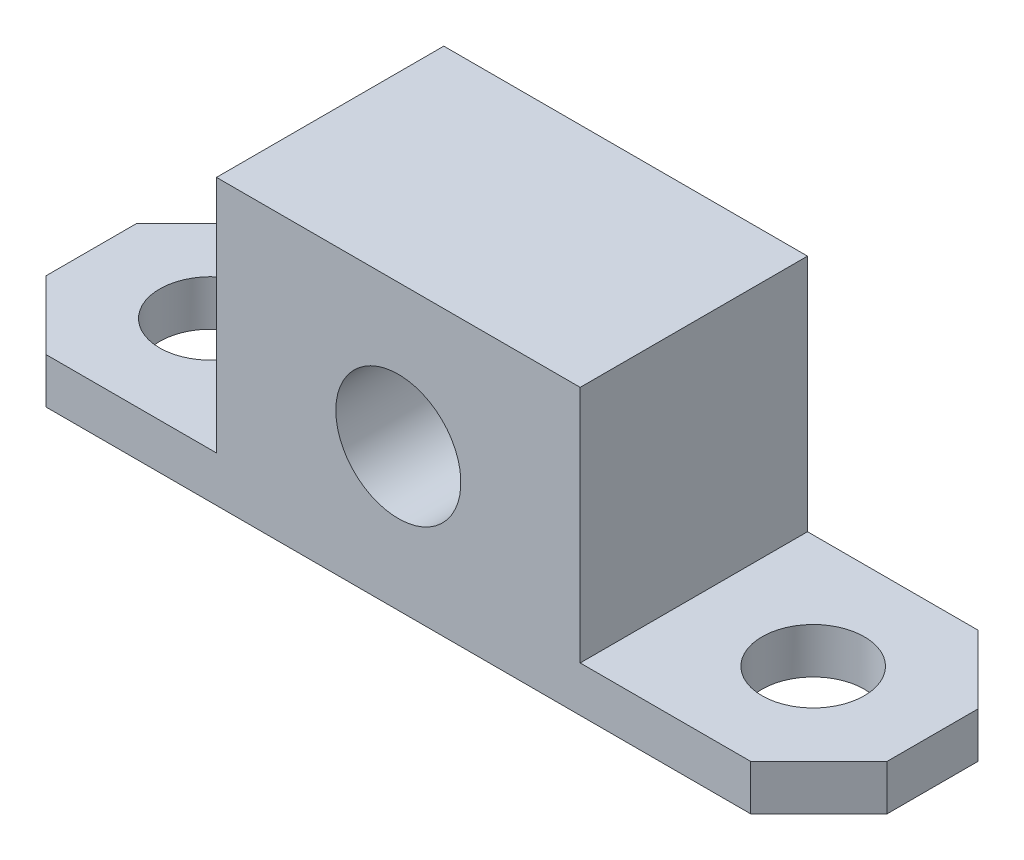
ISO-10303-21;
HEADER;
FILE_DESCRIPTION(('STEP AP214'),'2;1');
FILE_NAME('part.step','',(''),(''),'','','');
FILE_SCHEMA(('AUTOMOTIVE_DESIGN { 1 0 10303 214 1 1 1 1 }'));
ENDSEC;
DATA;
#1=APPLICATION_CONTEXT('core data for automotive mechanical design processes');
#2=APPLICATION_PROTOCOL_DEFINITION('international standard','automotive_design',2000,#1);
#3=PRODUCT_CONTEXT('',#1,'mechanical');
#4=PRODUCT('Part','Part','',(#3));
#5=PRODUCT_RELATED_PRODUCT_CATEGORY('part','',(#4));
#6=PRODUCT_DEFINITION_FORMATION('','',#4);
#7=PRODUCT_DEFINITION_CONTEXT('part definition',#1,'design');
#8=PRODUCT_DEFINITION('design','',#6,#7);
#9=PRODUCT_DEFINITION_SHAPE('','',#8);
#10=(LENGTH_UNIT() NAMED_UNIT(*) SI_UNIT(.MILLI.,.METRE.));
#11=(NAMED_UNIT(*) PLANE_ANGLE_UNIT() SI_UNIT($,.RADIAN.));
#12=(NAMED_UNIT(*) SI_UNIT($,.STERADIAN.) SOLID_ANGLE_UNIT());
#13=UNCERTAINTY_MEASURE_WITH_UNIT(LENGTH_MEASURE(1.E-05),#10,'distance_accuracy_value','');
#14=(GEOMETRIC_REPRESENTATION_CONTEXT(3) GLOBAL_UNCERTAINTY_ASSIGNED_CONTEXT((#13)) GLOBAL_UNIT_ASSIGNED_CONTEXT((#10,
#11,#12)) REPRESENTATION_CONTEXT('',''));
#15=CARTESIAN_POINT('',(0.,0.,0.));
#16=DIRECTION('',(0.,0.,1.));
#17=DIRECTION('',(1.,0.,0.));
#18=AXIS2_PLACEMENT_3D('',#15,#16,#17);
#19=CARTESIAN_POINT('',(0.,2.,0.));
#20=DIRECTION('',(0.,-1.,0.));
#21=DIRECTION('',(0.,0.,-1.));
#22=AXIS2_PLACEMENT_3D('',#19,#20,#21);
#23=PLANE('',#22);
#24=CARTESIAN_POINT('',(31.75,2.,-5.));
#25=DIRECTION('',(0.,1.,0.));
#26=DIRECTION('',(0.,0.,1.));
#27=AXIS2_PLACEMENT_3D('',#24,#25,#26);
#28=CIRCLE('',#27,2.25);
#29=CARTESIAN_POINT('',(31.75,2.,-2.75));
#30=VERTEX_POINT('',#29);
#31=EDGE_CURVE('E184',#30,#30,#28,.T.);
#32=ORIENTED_EDGE('',*,*,#31,.F.);
#33=EDGE_LOOP('',(#32));
#34=FACE_BOUND('',#33,.T.);
#35=DIRECTION('',(1.,0.,0.));
#36=VECTOR('',#35,1.);
#37=CARTESIAN_POINT('',(0.,2.,0.));
#38=LINE('',#37,#36);
#39=CARTESIAN_POINT('',(26.5,2.,0.));
#40=VERTEX_POINT('',#39);
#41=CARTESIAN_POINT('',(34.,2.,0.));
#42=VERTEX_POINT('',#41);
#43=EDGE_CURVE('E161',#40,#42,#38,.T.);
#44=ORIENTED_EDGE('',*,*,#43,.T.);
#45=DIRECTION('',(-0.707106781186548,0.,0.707106781186547));
#46=VECTOR('',#45,1.);
#47=CARTESIAN_POINT('',(37.,2.,-3.));
#48=LINE('',#47,#46);
#49=CARTESIAN_POINT('',(37.,2.,-3.));
#50=VERTEX_POINT('',#49);
#51=EDGE_CURVE('E11',#42,#50,#48,.F.);
#52=ORIENTED_EDGE('',*,*,#51,.T.);
#53=DIRECTION('',(0.,0.,-1.));
#54=VECTOR('',#53,1.);
#55=CARTESIAN_POINT('',(37.,2.,0.));
#56=LINE('',#55,#54);
#57=CARTESIAN_POINT('',(37.,2.,-6.99999999999998));
#58=VERTEX_POINT('',#57);
#59=EDGE_CURVE('E165',#50,#58,#56,.T.);
#60=ORIENTED_EDGE('',*,*,#59,.T.);
#61=DIRECTION('',(0.707106781186546,0.,0.707106781186549));
#62=VECTOR('',#61,1.);
#63=CARTESIAN_POINT('',(34.,2.,-10.));
#64=LINE('',#63,#62);
#65=CARTESIAN_POINT('',(34.,2.,-10.));
#66=VERTEX_POINT('',#65);
#67=EDGE_CURVE('E41',#58,#66,#64,.F.);
#68=ORIENTED_EDGE('',*,*,#67,.T.);
#69=DIRECTION('',(-1.,0.,0.));
#70=VECTOR('',#69,1.);
#71=CARTESIAN_POINT('',(0.,2.,-10.));
#72=LINE('',#71,#70);
#73=CARTESIAN_POINT('',(26.5,2.,-10.));
#74=VERTEX_POINT('',#73);
#75=EDGE_CURVE('E168',#66,#74,#72,.T.);
#76=ORIENTED_EDGE('',*,*,#75,.T.);
#77=DIRECTION('',(0.,0.,-1.));
#78=VECTOR('',#77,1.);
#79=CARTESIAN_POINT('',(26.5,2.,0.));
#80=LINE('',#79,#78);
#81=EDGE_CURVE('E148',#40,#74,#80,.T.);
#82=ORIENTED_EDGE('',*,*,#81,.F.);
#83=EDGE_LOOP('',(#44,#52,#60,#68,#76,#82));
#84=FACE_BOUND('',#83,.T.);
#85=ADVANCED_FACE('F33',(#34,#84),#23,.F.);
#86=CARTESIAN_POINT('',(5.25,2.,-5.));
#87=DIRECTION('',(0.,1.,0.));
#88=DIRECTION('',(0.,0.,1.));
#89=AXIS2_PLACEMENT_3D('',#86,#87,#88);
#90=CIRCLE('',#89,2.25);
#91=CARTESIAN_POINT('',(5.25,2.,-2.75));
#92=VERTEX_POINT('',#91);
#93=EDGE_CURVE('E180',#92,#92,#90,.T.);
#94=ORIENTED_EDGE('',*,*,#93,.F.);
#95=EDGE_LOOP('',(#94));
#96=FACE_BOUND('',#95,.T.);
#97=CARTESIAN_POINT('',(10.5,2.,-10.));
#98=VERTEX_POINT('',#97);
#99=CARTESIAN_POINT('',(3.00000000000001,2.,-10.));
#100=VERTEX_POINT('',#99);
#101=EDGE_CURVE('E167',#98,#100,#72,.T.);
#102=ORIENTED_EDGE('',*,*,#101,.T.);
#103=DIRECTION('',(0.707106781186548,0.,-0.707106781186547));
#104=VECTOR('',#103,1.);
#105=CARTESIAN_POINT('',(0.,2.,-7.));
#106=LINE('',#105,#104);
#107=CARTESIAN_POINT('',(0.,2.,-7.));
#108=VERTEX_POINT('',#107);
#109=EDGE_CURVE('E204',#100,#108,#106,.F.);
#110=ORIENTED_EDGE('',*,*,#109,.T.);
#111=DIRECTION('',(0.,0.,1.));
#112=VECTOR('',#111,1.);
#113=CARTESIAN_POINT('',(0.,2.,0.));
#114=LINE('',#113,#112);
#115=CARTESIAN_POINT('',(0.,2.,-3.00000000000001));
#116=VERTEX_POINT('',#115);
#117=EDGE_CURVE('E158',#108,#116,#114,.T.);
#118=ORIENTED_EDGE('',*,*,#117,.T.);
#119=DIRECTION('',(-0.707106781186547,0.,-0.707106781186548));
#120=VECTOR('',#119,1.);
#121=CARTESIAN_POINT('',(3.,2.,0.));
#122=LINE('',#121,#120);
#123=CARTESIAN_POINT('',(3.,2.,0.));
#124=VERTEX_POINT('',#123);
#125=EDGE_CURVE('E202',#116,#124,#122,.F.);
#126=ORIENTED_EDGE('',*,*,#125,.T.);
#127=CARTESIAN_POINT('',(10.5,2.,0.));
#128=VERTEX_POINT('',#127);
#129=EDGE_CURVE('E163',#124,#128,#38,.T.);
#130=ORIENTED_EDGE('',*,*,#129,.T.);
#131=DIRECTION('',(0.,0.,1.));
#132=VECTOR('',#131,1.);
#133=CARTESIAN_POINT('',(10.5,2.,0.));
#134=LINE('',#133,#132);
#135=EDGE_CURVE('E145',#98,#128,#134,.T.);
#136=ORIENTED_EDGE('',*,*,#135,.F.);
#137=EDGE_LOOP('',(#102,#110,#118,#126,#130,#136));
#138=FACE_BOUND('',#137,.T.);
#139=ADVANCED_FACE('F248',(#96,#138),#23,.F.);
#140=CARTESIAN_POINT('',(0.,2.,0.));
#141=DIRECTION('',(1.,0.,0.));
#142=DIRECTION('',(0.,0.,-1.));
#143=AXIS2_PLACEMENT_3D('',#140,#141,#142);
#144=PLANE('',#143);
#145=ORIENTED_EDGE('',*,*,#117,.F.);
#146=DIRECTION('',(0.,-1.,0.));
#147=VECTOR('',#146,1.);
#148=CARTESIAN_POINT('',(0.,2.,-7.));
#149=LINE('',#148,#147);
#150=CARTESIAN_POINT('',(0.,0.,-7.));
#151=VERTEX_POINT('',#150);
#152=EDGE_CURVE('E186',#108,#151,#149,.T.);
#153=ORIENTED_EDGE('',*,*,#152,.T.);
#154=DIRECTION('',(0.,0.,1.));
#155=VECTOR('',#154,1.);
#156=CARTESIAN_POINT('',(0.,0.,0.));
#157=LINE('',#156,#155);
#158=CARTESIAN_POINT('',(0.,0.,-3.00000000000001));
#159=VERTEX_POINT('',#158);
#160=EDGE_CURVE('E149',#151,#159,#157,.T.);
#161=ORIENTED_EDGE('',*,*,#160,.T.);
#162=DIRECTION('',(0.,1.,0.));
#163=VECTOR('',#162,1.);
#164=CARTESIAN_POINT('',(0.,2.,-3.00000000000001));
#165=LINE('',#164,#163);
#166=EDGE_CURVE('E169',#159,#116,#165,.T.);
#167=ORIENTED_EDGE('',*,*,#166,.T.);
#168=EDGE_LOOP('',(#145,#153,#161,#167));
#169=FACE_BOUND('',#168,.T.);
#170=ADVANCED_FACE('F240',(#169),#144,.F.);
#171=CARTESIAN_POINT('',(0.,2.,0.));
#172=DIRECTION('',(0.,0.,-1.));
#173=DIRECTION('',(-1.,0.,0.));
#174=AXIS2_PLACEMENT_3D('',#171,#172,#173);
#175=PLANE('',#174);
#176=CARTESIAN_POINT('',(18.5,6.25,0.));
#177=DIRECTION('',(0.,0.,-1.));
#178=DIRECTION('',(-1.,0.,0.));
#179=AXIS2_PLACEMENT_3D('',#176,#177,#178);
#180=CIRCLE('',#179,2.75);
#181=CARTESIAN_POINT('',(15.75,6.25,0.));
#182=VERTEX_POINT('',#181);
#183=EDGE_CURVE('E253',#182,#182,#180,.T.);
#184=ORIENTED_EDGE('',*,*,#183,.T.);
#185=EDGE_LOOP('',(#184));
#186=FACE_BOUND('',#185,.T.);
#187=ORIENTED_EDGE('',*,*,#129,.F.);
#188=DIRECTION('',(0.,-1.,0.));
#189=VECTOR('',#188,1.);
#190=CARTESIAN_POINT('',(3.,2.,0.));
#191=LINE('',#190,#189);
#192=CARTESIAN_POINT('',(3.,0.,0.));
#193=VERTEX_POINT('',#192);
#194=EDGE_CURVE('E208',#124,#193,#191,.T.);
#195=ORIENTED_EDGE('',*,*,#194,.T.);
#196=DIRECTION('',(1.,0.,0.));
#197=VECTOR('',#196,1.);
#198=CARTESIAN_POINT('',(0.,0.,0.));
#199=LINE('',#198,#197);
#200=CARTESIAN_POINT('',(34.,0.,0.));
#201=VERTEX_POINT('',#200);
#202=EDGE_CURVE('E152',#193,#201,#199,.T.);
#203=ORIENTED_EDGE('',*,*,#202,.T.);
#204=DIRECTION('',(0.,1.,0.));
#205=VECTOR('',#204,1.);
#206=CARTESIAN_POINT('',(34.,2.,0.));
#207=LINE('',#206,#205);
#208=EDGE_CURVE('E206',#201,#42,#207,.T.);
#209=ORIENTED_EDGE('',*,*,#208,.T.);
#210=ORIENTED_EDGE('',*,*,#43,.F.);
#211=DIRECTION('',(0.,-1.,0.));
#212=VECTOR('',#211,1.);
#213=CARTESIAN_POINT('',(26.5,12.5,0.));
#214=LINE('',#213,#212);
#215=CARTESIAN_POINT('',(26.5,12.5,0.));
#216=VERTEX_POINT('',#215);
#217=EDGE_CURVE('E257',#216,#40,#214,.T.);
#218=ORIENTED_EDGE('',*,*,#217,.F.);
#219=DIRECTION('',(1.,0.,0.));
#220=VECTOR('',#219,1.);
#221=CARTESIAN_POINT('',(10.5,12.5,0.));
#222=LINE('',#221,#220);
#223=CARTESIAN_POINT('',(10.5,12.5,0.));
#224=VERTEX_POINT('',#223);
#225=EDGE_CURVE('E141',#224,#216,#222,.T.);
#226=ORIENTED_EDGE('',*,*,#225,.F.);
#227=DIRECTION('',(0.,-1.,0.));
#228=VECTOR('',#227,1.);
#229=CARTESIAN_POINT('',(10.5,12.5,0.));
#230=LINE('',#229,#228);
#231=EDGE_CURVE('E154',#224,#128,#230,.T.);
#232=ORIENTED_EDGE('',*,*,#231,.T.);
#233=EDGE_LOOP('',(#187,#195,#203,#209,#210,#218,#226,#232));
#234=FACE_BOUND('',#233,.T.);
#235=ADVANCED_FACE('F230',(#186,#234),#175,.F.);
#236=CARTESIAN_POINT('',(37.,2.,0.));
#237=DIRECTION('',(-1.,0.,0.));
#238=DIRECTION('',(0.,0.,1.));
#239=AXIS2_PLACEMENT_3D('',#236,#237,#238);
#240=PLANE('',#239);
#241=ORIENTED_EDGE('',*,*,#59,.F.);
#242=DIRECTION('',(0.,-1.,0.));
#243=VECTOR('',#242,1.);
#244=CARTESIAN_POINT('',(37.,2.,-3.));
#245=LINE('',#244,#243);
#246=CARTESIAN_POINT('',(37.,0.,-3.));
#247=VERTEX_POINT('',#246);
#248=EDGE_CURVE('E212',#50,#247,#245,.T.);
#249=ORIENTED_EDGE('',*,*,#248,.T.);
#250=DIRECTION('',(0.,0.,-1.));
#251=VECTOR('',#250,1.);
#252=CARTESIAN_POINT('',(37.,0.,0.));
#253=LINE('',#252,#251);
#254=CARTESIAN_POINT('',(37.,0.,-6.99999999999998));
#255=VERTEX_POINT('',#254);
#256=EDGE_CURVE('E173',#247,#255,#253,.T.);
#257=ORIENTED_EDGE('',*,*,#256,.T.);
#258=DIRECTION('',(0.,1.,0.));
#259=VECTOR('',#258,1.);
#260=CARTESIAN_POINT('',(37.,2.,-6.99999999999998));
#261=LINE('',#260,#259);
#262=EDGE_CURVE('E48',#255,#58,#261,.T.);
#263=ORIENTED_EDGE('',*,*,#262,.T.);
#264=EDGE_LOOP('',(#241,#249,#257,#263));
#265=FACE_BOUND('',#264,.T.);
#266=ADVANCED_FACE('F222',(#265),#240,.F.);
#267=CARTESIAN_POINT('',(0.,2.,-10.));
#268=DIRECTION('',(0.,0.,1.));
#269=DIRECTION('',(1.,0.,0.));
#270=AXIS2_PLACEMENT_3D('',#267,#268,#269);
#271=PLANE('',#270);
#272=CARTESIAN_POINT('',(18.5,6.25,-10.));
#273=DIRECTION('',(0.,0.,-1.));
#274=DIRECTION('',(-1.,0.,0.));
#275=AXIS2_PLACEMENT_3D('',#272,#273,#274);
#276=CIRCLE('',#275,2.75);
#277=CARTESIAN_POINT('',(15.75,6.25,-10.));
#278=VERTEX_POINT('',#277);
#279=EDGE_CURVE('E179',#278,#278,#276,.T.);
#280=ORIENTED_EDGE('',*,*,#279,.F.);
#281=EDGE_LOOP('',(#280));
#282=FACE_BOUND('',#281,.T.);
#283=DIRECTION('',(-1.,0.,0.));
#284=VECTOR('',#283,1.);
#285=CARTESIAN_POINT('',(0.,0.,-10.));
#286=LINE('',#285,#284);
#287=CARTESIAN_POINT('',(34.,0.,-10.));
#288=VERTEX_POINT('',#287);
#289=CARTESIAN_POINT('',(3.00000000000001,0.,-10.));
#290=VERTEX_POINT('',#289);
#291=EDGE_CURVE('E162',#288,#290,#286,.T.);
#292=ORIENTED_EDGE('',*,*,#291,.T.);
#293=DIRECTION('',(0.,1.,0.));
#294=VECTOR('',#293,1.);
#295=CARTESIAN_POINT('',(3.00000000000001,2.,-10.));
#296=LINE('',#295,#294);
#297=EDGE_CURVE('E200',#290,#100,#296,.T.);
#298=ORIENTED_EDGE('',*,*,#297,.T.);
#299=ORIENTED_EDGE('',*,*,#101,.F.);
#300=DIRECTION('',(0.,-1.,0.));
#301=VECTOR('',#300,1.);
#302=CARTESIAN_POINT('',(10.5,12.5,-10.));
#303=LINE('',#302,#301);
#304=CARTESIAN_POINT('',(10.5,12.5,-10.));
#305=VERTEX_POINT('',#304);
#306=EDGE_CURVE('E132',#305,#98,#303,.T.);
#307=ORIENTED_EDGE('',*,*,#306,.F.);
#308=DIRECTION('',(-1.,0.,0.));
#309=VECTOR('',#308,1.);
#310=CARTESIAN_POINT('',(10.5,12.5,-10.));
#311=LINE('',#310,#309);
#312=CARTESIAN_POINT('',(26.5,12.5,-10.));
#313=VERTEX_POINT('',#312);
#314=EDGE_CURVE('E122',#313,#305,#311,.T.);
#315=ORIENTED_EDGE('',*,*,#314,.F.);
#316=DIRECTION('',(0.,-1.,0.));
#317=VECTOR('',#316,1.);
#318=CARTESIAN_POINT('',(26.5,12.5,-10.));
#319=LINE('',#318,#317);
#320=EDGE_CURVE('E128',#313,#74,#319,.T.);
#321=ORIENTED_EDGE('',*,*,#320,.T.);
#322=ORIENTED_EDGE('',*,*,#75,.F.);
#323=DIRECTION('',(0.,-1.,0.));
#324=VECTOR('',#323,1.);
#325=CARTESIAN_POINT('',(34.,2.,-10.));
#326=LINE('',#325,#324);
#327=EDGE_CURVE('E197',#66,#288,#326,.T.);
#328=ORIENTED_EDGE('',*,*,#327,.T.);
#329=EDGE_LOOP('',(#292,#298,#299,#307,#315,#321,#322,#328));
#330=FACE_BOUND('',#329,.T.);
#331=ADVANCED_FACE('F125',(#282,#330),#271,.F.);
#332=CARTESIAN_POINT('',(0.,0.,0.));
#333=DIRECTION('',(0.,-1.,0.));
#334=DIRECTION('',(0.,0.,-1.));
#335=AXIS2_PLACEMENT_3D('',#332,#333,#334);
#336=PLANE('',#335);
#337=CARTESIAN_POINT('',(31.75,0.,-5.));
#338=DIRECTION('',(0.,-1.,0.));
#339=DIRECTION('',(0.,0.,-1.));
#340=AXIS2_PLACEMENT_3D('',#337,#338,#339);
#341=CIRCLE('',#340,2.25);
#342=CARTESIAN_POINT('',(31.75,0.,-7.25));
#343=VERTEX_POINT('',#342);
#344=EDGE_CURVE('E181',#343,#343,#341,.T.);
#345=ORIENTED_EDGE('',*,*,#344,.F.);
#346=EDGE_LOOP('',(#345));
#347=FACE_BOUND('',#346,.T.);
#348=CARTESIAN_POINT('',(5.25,0.,-5.));
#349=DIRECTION('',(0.,-1.,0.));
#350=DIRECTION('',(0.,0.,-1.));
#351=AXIS2_PLACEMENT_3D('',#348,#349,#350);
#352=CIRCLE('',#351,2.25);
#353=CARTESIAN_POINT('',(5.25,0.,-7.25));
#354=VERTEX_POINT('',#353);
#355=EDGE_CURVE('E176',#354,#354,#352,.T.);
#356=ORIENTED_EDGE('',*,*,#355,.F.);
#357=EDGE_LOOP('',(#356));
#358=FACE_BOUND('',#357,.T.);
#359=ORIENTED_EDGE('',*,*,#160,.F.);
#360=DIRECTION('',(-0.707106781186548,0.,0.707106781186547));
#361=VECTOR('',#360,1.);
#362=CARTESIAN_POINT('',(-3.5,0.,-3.5));
#363=LINE('',#362,#361);
#364=EDGE_CURVE('E195',#151,#290,#363,.F.);
#365=ORIENTED_EDGE('',*,*,#364,.T.);
#366=ORIENTED_EDGE('',*,*,#291,.F.);
#367=DIRECTION('',(-0.707106781186546,0.,-0.707106781186549));
#368=VECTOR('',#367,1.);
#369=CARTESIAN_POINT('',(22.0000000000001,0.,-22.));
#370=LINE('',#369,#368);
#371=EDGE_CURVE('E189',#288,#255,#370,.F.);
#372=ORIENTED_EDGE('',*,*,#371,.T.);
#373=ORIENTED_EDGE('',*,*,#256,.F.);
#374=DIRECTION('',(0.707106781186548,0.,-0.707106781186547));
#375=VECTOR('',#374,1.);
#376=CARTESIAN_POINT('',(17.,0.,17.));
#377=LINE('',#376,#375);
#378=EDGE_CURVE('E191',#247,#201,#377,.F.);
#379=ORIENTED_EDGE('',*,*,#378,.T.);
#380=ORIENTED_EDGE('',*,*,#202,.F.);
#381=DIRECTION('',(0.707106781186547,0.,0.707106781186548));
#382=VECTOR('',#381,1.);
#383=CARTESIAN_POINT('',(1.5,0.,-1.5));
#384=LINE('',#383,#382);
#385=EDGE_CURVE('E193',#193,#159,#384,.F.);
#386=ORIENTED_EDGE('',*,*,#385,.T.);
#387=EDGE_LOOP('',(#359,#365,#366,#372,#373,#379,#380,#386));
#388=FACE_BOUND('',#387,.T.);
#389=ADVANCED_FACE('F221',(#347,#358,#388),#336,.T.);
#390=CARTESIAN_POINT('',(26.5,12.5,0.));
#391=DIRECTION('',(-1.,0.,0.));
#392=DIRECTION('',(0.,0.,1.));
#393=AXIS2_PLACEMENT_3D('',#390,#391,#392);
#394=PLANE('',#393);
#395=ORIENTED_EDGE('',*,*,#81,.T.);
#396=ORIENTED_EDGE('',*,*,#320,.F.);
#397=DIRECTION('',(0.,0.,-1.));
#398=VECTOR('',#397,1.);
#399=CARTESIAN_POINT('',(26.5,12.5,0.));
#400=LINE('',#399,#398);
#401=EDGE_CURVE('E136',#216,#313,#400,.T.);
#402=ORIENTED_EDGE('',*,*,#401,.F.);
#403=ORIENTED_EDGE('',*,*,#217,.T.);
#404=EDGE_LOOP('',(#395,#396,#402,#403));
#405=FACE_BOUND('',#404,.T.);
#406=ADVANCED_FACE('F147',(#405),#394,.F.);
#407=CARTESIAN_POINT('',(10.5,12.5,0.));
#408=DIRECTION('',(1.,0.,0.));
#409=DIRECTION('',(0.,0.,-1.));
#410=AXIS2_PLACEMENT_3D('',#407,#408,#409);
#411=PLANE('',#410);
#412=ORIENTED_EDGE('',*,*,#135,.T.);
#413=ORIENTED_EDGE('',*,*,#231,.F.);
#414=DIRECTION('',(0.,0.,1.));
#415=VECTOR('',#414,1.);
#416=CARTESIAN_POINT('',(10.5,12.5,0.));
#417=LINE('',#416,#415);
#418=EDGE_CURVE('E135',#305,#224,#417,.T.);
#419=ORIENTED_EDGE('',*,*,#418,.F.);
#420=ORIENTED_EDGE('',*,*,#306,.T.);
#421=EDGE_LOOP('',(#412,#413,#419,#420));
#422=FACE_BOUND('',#421,.T.);
#423=ADVANCED_FACE('F258',(#422),#411,.F.);
#424=CARTESIAN_POINT('',(0.,12.5,0.));
#425=DIRECTION('',(0.,-1.,0.));
#426=DIRECTION('',(0.,0.,-1.));
#427=AXIS2_PLACEMENT_3D('',#424,#425,#426);
#428=PLANE('',#427);
#429=ORIENTED_EDGE('',*,*,#401,.T.);
#430=ORIENTED_EDGE('',*,*,#314,.T.);
#431=ORIENTED_EDGE('',*,*,#418,.T.);
#432=ORIENTED_EDGE('',*,*,#225,.T.);
#433=EDGE_LOOP('',(#429,#430,#431,#432));
#434=FACE_BOUND('',#433,.T.);
#435=ADVANCED_FACE('F139',(#434),#428,.F.);
#436=CARTESIAN_POINT('',(18.5,6.25,0.));
#437=DIRECTION('',(0.,0.,-1.));
#438=DIRECTION('',(-1.,0.,0.));
#439=AXIS2_PLACEMENT_3D('',#436,#437,#438);
#440=CYLINDRICAL_SURFACE('',#439,2.75);
#441=ORIENTED_EDGE('',*,*,#183,.F.);
#442=EDGE_LOOP('',(#441));
#443=FACE_BOUND('',#442,.T.);
#444=ORIENTED_EDGE('',*,*,#279,.T.);
#445=EDGE_LOOP('',(#444));
#446=FACE_BOUND('',#445,.T.);
#447=ADVANCED_FACE('F386',(#443,#446),#440,.F.);
#448=CARTESIAN_POINT('',(5.25,-8.,-5.));
#449=DIRECTION('',(0.,1.,0.));
#450=DIRECTION('',(0.,0.,1.));
#451=AXIS2_PLACEMENT_3D('',#448,#449,#450);
#452=CYLINDRICAL_SURFACE('',#451,2.25);
#453=ORIENTED_EDGE('',*,*,#355,.T.);
#454=EDGE_LOOP('',(#453));
#455=FACE_BOUND('',#454,.T.);
#456=ORIENTED_EDGE('',*,*,#93,.T.);
#457=EDGE_LOOP('',(#456));
#458=FACE_BOUND('',#457,.T.);
#459=ADVANCED_FACE('F393',(#455,#458),#452,.F.);
#460=CARTESIAN_POINT('',(31.75,-8.,-5.));
#461=DIRECTION('',(0.,1.,0.));
#462=DIRECTION('',(0.,0.,1.));
#463=AXIS2_PLACEMENT_3D('',#460,#461,#462);
#464=CYLINDRICAL_SURFACE('',#463,2.25);
#465=ORIENTED_EDGE('',*,*,#344,.T.);
#466=EDGE_LOOP('',(#465));
#467=FACE_BOUND('',#466,.T.);
#468=ORIENTED_EDGE('',*,*,#31,.T.);
#469=EDGE_LOOP('',(#468));
#470=FACE_BOUND('',#469,.T.);
#471=ADVANCED_FACE('F270',(#467,#470),#464,.F.);
#472=CARTESIAN_POINT('',(0.,2.,-7.));
#473=DIRECTION('',(0.707106781186547,0.,0.707106781186548));
#474=DIRECTION('',(0.,-1.,0.));
#475=AXIS2_PLACEMENT_3D('',#472,#473,#474);
#476=PLANE('',#475);
#477=ORIENTED_EDGE('',*,*,#109,.F.);
#478=ORIENTED_EDGE('',*,*,#297,.F.);
#479=ORIENTED_EDGE('',*,*,#364,.F.);
#480=ORIENTED_EDGE('',*,*,#152,.F.);
#481=EDGE_LOOP('',(#477,#478,#479,#480));
#482=FACE_BOUND('',#481,.T.);
#483=ADVANCED_FACE('F244',(#482),#476,.F.);
#484=CARTESIAN_POINT('',(3.,2.,0.));
#485=DIRECTION('',(0.707106781186548,0.,-0.707106781186547));
#486=DIRECTION('',(0.,-1.,0.));
#487=AXIS2_PLACEMENT_3D('',#484,#485,#486);
#488=PLANE('',#487);
#489=ORIENTED_EDGE('',*,*,#125,.F.);
#490=ORIENTED_EDGE('',*,*,#166,.F.);
#491=ORIENTED_EDGE('',*,*,#385,.F.);
#492=ORIENTED_EDGE('',*,*,#194,.F.);
#493=EDGE_LOOP('',(#489,#490,#491,#492));
#494=FACE_BOUND('',#493,.T.);
#495=ADVANCED_FACE('F236',(#494),#488,.F.);
#496=CARTESIAN_POINT('',(37.,2.,-3.));
#497=DIRECTION('',(-0.707106781186547,0.,-0.707106781186548));
#498=DIRECTION('',(0.,-1.,0.));
#499=AXIS2_PLACEMENT_3D('',#496,#497,#498);
#500=PLANE('',#499);
#501=ORIENTED_EDGE('',*,*,#51,.F.);
#502=ORIENTED_EDGE('',*,*,#208,.F.);
#503=ORIENTED_EDGE('',*,*,#378,.F.);
#504=ORIENTED_EDGE('',*,*,#248,.F.);
#505=EDGE_LOOP('',(#501,#502,#503,#504));
#506=FACE_BOUND('',#505,.T.);
#507=ADVANCED_FACE('F225',(#506),#500,.F.);
#508=CARTESIAN_POINT('',(34.,2.,-10.));
#509=DIRECTION('',(-0.707106781186549,0.,0.707106781186546));
#510=DIRECTION('',(0.,-1.,0.));
#511=AXIS2_PLACEMENT_3D('',#508,#509,#510);
#512=PLANE('',#511);
#513=ORIENTED_EDGE('',*,*,#67,.F.);
#514=ORIENTED_EDGE('',*,*,#262,.F.);
#515=ORIENTED_EDGE('',*,*,#371,.F.);
#516=ORIENTED_EDGE('',*,*,#327,.F.);
#517=EDGE_LOOP('',(#513,#514,#515,#516));
#518=FACE_BOUND('',#517,.T.);
#519=ADVANCED_FACE('F35',(#518),#512,.F.);
#520=CLOSED_SHELL('',(#85,#139,#170,#235,#266,#331,#389,#406,#423,#435,#447,#459,#471,#483,#495,
#507,#519));
#521=MANIFOLD_SOLID_BREP('B2',#520);
#522=ADVANCED_BREP_SHAPE_REPRESENTATION('',(#18,#521),#14);
#523=SHAPE_DEFINITION_REPRESENTATION(#9,#522);
ENDSEC;
END-ISO-10303-21;
